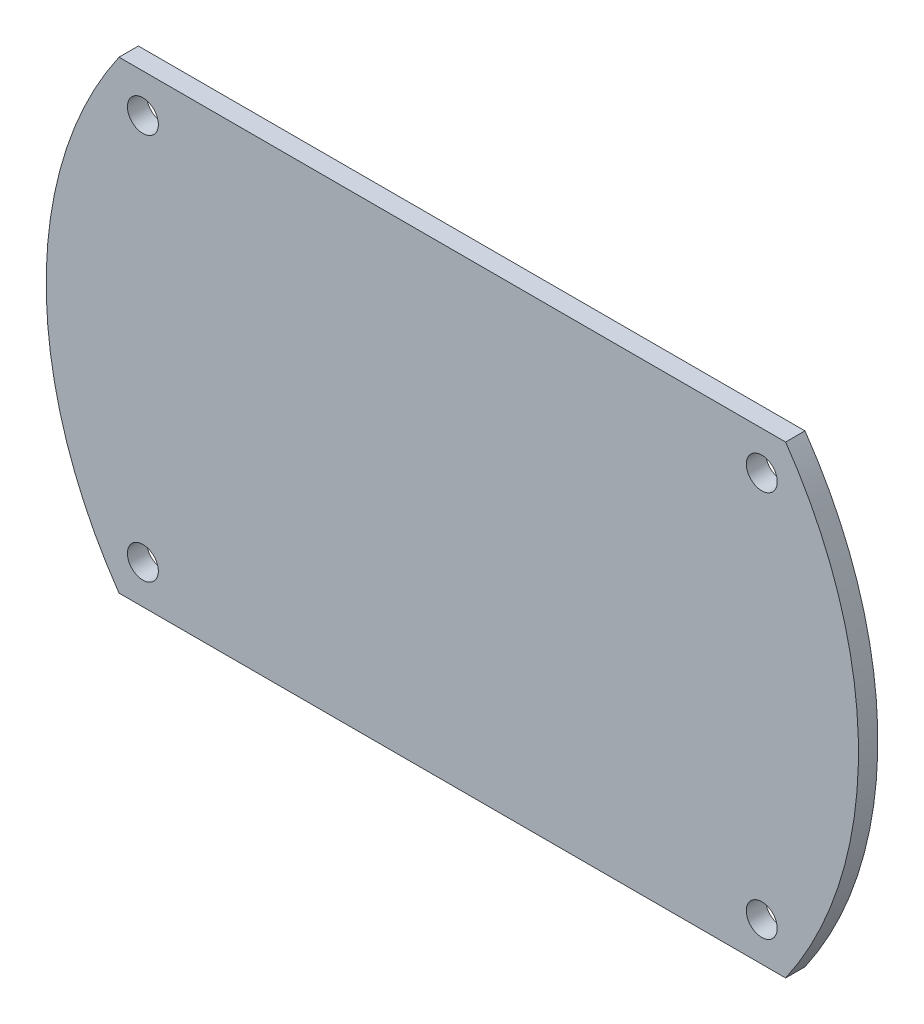
ISO-10303-21;
HEADER;
FILE_DESCRIPTION(('STEP AP214'),'2;1');
FILE_NAME('part.step','',(''),(''),'','','');
FILE_SCHEMA(('AUTOMOTIVE_DESIGN { 1 0 10303 214 1 1 1 1 }'));
ENDSEC;
DATA;
#1=APPLICATION_CONTEXT('core data for automotive mechanical design processes');
#2=APPLICATION_PROTOCOL_DEFINITION('international standard','automotive_design',2000,#1);
#3=PRODUCT_CONTEXT('',#1,'mechanical');
#4=PRODUCT('Part','Part','',(#3));
#5=PRODUCT_RELATED_PRODUCT_CATEGORY('part','',(#4));
#6=PRODUCT_DEFINITION_FORMATION('','',#4);
#7=PRODUCT_DEFINITION_CONTEXT('part definition',#1,'design');
#8=PRODUCT_DEFINITION('design','',#6,#7);
#9=PRODUCT_DEFINITION_SHAPE('','',#8);
#10=(LENGTH_UNIT() NAMED_UNIT(*) SI_UNIT(.MILLI.,.METRE.));
#11=(NAMED_UNIT(*) PLANE_ANGLE_UNIT() SI_UNIT($,.RADIAN.));
#12=(NAMED_UNIT(*) SI_UNIT($,.STERADIAN.) SOLID_ANGLE_UNIT());
#13=UNCERTAINTY_MEASURE_WITH_UNIT(LENGTH_MEASURE(1.E-05),#10,'distance_accuracy_value','');
#14=(GEOMETRIC_REPRESENTATION_CONTEXT(3) GLOBAL_UNCERTAINTY_ASSIGNED_CONTEXT((#13)) GLOBAL_UNIT_ASSIGNED_CONTEXT((#10,
#11,#12)) REPRESENTATION_CONTEXT('',''));
#15=CARTESIAN_POINT('',(0.,0.,0.));
#16=DIRECTION('',(0.,0.,1.));
#17=DIRECTION('',(1.,0.,0.));
#18=AXIS2_PLACEMENT_3D('',#15,#16,#17);
#19=CARTESIAN_POINT('',(0.,0.,5.));
#20=DIRECTION('',(0.,0.,-1.));
#21=DIRECTION('',(-1.,0.,0.));
#22=AXIS2_PLACEMENT_3D('',#19,#20,#21);
#23=CYLINDRICAL_SURFACE('',#22,105.);
#24=CARTESIAN_POINT('',(0.,0.,5.));
#25=DIRECTION('',(0.,0.,1.));
#26=DIRECTION('',(1.,0.,0.));
#27=AXIS2_PLACEMENT_3D('',#24,#25,#26);
#28=CIRCLE('',#27,105.);
#29=CARTESIAN_POINT('',(-86.1684396980704,60.,5.));
#30=VERTEX_POINT('',#29);
#31=CARTESIAN_POINT('',(-86.1684396980704,-60.,5.));
#32=VERTEX_POINT('',#31);
#33=EDGE_CURVE('E92',#30,#32,#28,.T.);
#34=ORIENTED_EDGE('',*,*,#33,.F.);
#35=DIRECTION('',(0.,0.,-1.));
#36=VECTOR('',#35,1.);
#37=CARTESIAN_POINT('',(-86.1684396980704,60.,5.));
#38=LINE('',#37,#36);
#39=CARTESIAN_POINT('',(-86.1684396980704,60.,0.));
#40=VERTEX_POINT('',#39);
#41=EDGE_CURVE('E11',#30,#40,#38,.T.);
#42=ORIENTED_EDGE('',*,*,#41,.T.);
#43=CARTESIAN_POINT('',(0.,0.,0.));
#44=DIRECTION('',(0.,0.,1.));
#45=DIRECTION('',(1.,0.,0.));
#46=AXIS2_PLACEMENT_3D('',#43,#44,#45);
#47=CIRCLE('',#46,105.);
#48=CARTESIAN_POINT('',(-86.1684396980704,-60.,0.));
#49=VERTEX_POINT('',#48);
#50=EDGE_CURVE('E94',#40,#49,#47,.T.);
#51=ORIENTED_EDGE('',*,*,#50,.T.);
#52=DIRECTION('',(0.,0.,-1.));
#53=VECTOR('',#52,1.);
#54=CARTESIAN_POINT('',(-86.1684396980704,-60.,5.));
#55=LINE('',#54,#53);
#56=EDGE_CURVE('E83',#49,#32,#55,.F.);
#57=ORIENTED_EDGE('',*,*,#56,.T.);
#58=EDGE_LOOP('',(#34,#42,#51,#57));
#59=FACE_BOUND('',#58,.T.);
#60=ADVANCED_FACE('F36',(#59),#23,.T.);
#61=CARTESIAN_POINT('',(0.,0.,5.));
#62=DIRECTION('',(0.,0.,1.));
#63=DIRECTION('',(1.,0.,0.));
#64=AXIS2_PLACEMENT_3D('',#61,#62,#63);
#65=PLANE('',#64);
#66=DIRECTION('',(1.,0.,0.));
#67=VECTOR('',#66,1.);
#68=CARTESIAN_POINT('',(125.,60.,5.));
#69=LINE('',#68,#67);
#70=CARTESIAN_POINT('',(86.1684396980704,60.,5.));
#71=VERTEX_POINT('',#70);
#72=EDGE_CURVE('E59',#30,#71,#69,.T.);
#73=ORIENTED_EDGE('',*,*,#72,.F.);
#74=ORIENTED_EDGE('',*,*,#33,.T.);
#75=DIRECTION('',(-1.,0.,0.));
#76=VECTOR('',#75,1.);
#77=CARTESIAN_POINT('',(125.,-60.,5.));
#78=LINE('',#77,#76);
#79=CARTESIAN_POINT('',(86.1684396980704,-60.,5.));
#80=VERTEX_POINT('',#79);
#81=EDGE_CURVE('E51',#80,#32,#78,.T.);
#82=ORIENTED_EDGE('',*,*,#81,.F.);
#83=EDGE_CURVE('E90',#80,#71,#28,.T.);
#84=ORIENTED_EDGE('',*,*,#83,.T.);
#85=EDGE_LOOP('',(#73,#74,#82,#84));
#86=FACE_BOUND('',#85,.T.);
#87=CARTESIAN_POINT('',(80.,-50.,5.));
#88=DIRECTION('',(0.,0.,1.));
#89=DIRECTION('',(1.,0.,0.));
#90=AXIS2_PLACEMENT_3D('',#87,#88,#89);
#91=CIRCLE('',#90,4.00000000000001);
#92=CARTESIAN_POINT('',(84.,-50.,5.));
#93=VERTEX_POINT('',#92);
#94=EDGE_CURVE('E122',#93,#93,#91,.T.);
#95=ORIENTED_EDGE('',*,*,#94,.F.);
#96=EDGE_LOOP('',(#95));
#97=FACE_BOUND('',#96,.T.);
#98=CARTESIAN_POINT('',(-80.,50.,5.));
#99=DIRECTION('',(0.,0.,1.));
#100=DIRECTION('',(1.,0.,0.));
#101=AXIS2_PLACEMENT_3D('',#98,#99,#100);
#102=CIRCLE('',#101,4.00000000000001);
#103=CARTESIAN_POINT('',(-76.,50.,5.));
#104=VERTEX_POINT('',#103);
#105=EDGE_CURVE('E103',#104,#104,#102,.T.);
#106=ORIENTED_EDGE('',*,*,#105,.F.);
#107=EDGE_LOOP('',(#106));
#108=FACE_BOUND('',#107,.T.);
#109=CARTESIAN_POINT('',(80.,50.,5.));
#110=DIRECTION('',(0.,0.,1.));
#111=DIRECTION('',(-1.,0.,0.));
#112=AXIS2_PLACEMENT_3D('',#109,#110,#111);
#113=CIRCLE('',#112,4.00000000000001);
#114=CARTESIAN_POINT('',(76.,50.,5.));
#115=VERTEX_POINT('',#114);
#116=EDGE_CURVE('E128',#115,#115,#113,.T.);
#117=ORIENTED_EDGE('',*,*,#116,.F.);
#118=EDGE_LOOP('',(#117));
#119=FACE_BOUND('',#118,.T.);
#120=CARTESIAN_POINT('',(-80.,-50.,5.));
#121=DIRECTION('',(0.,0.,1.));
#122=DIRECTION('',(-1.,0.,0.));
#123=AXIS2_PLACEMENT_3D('',#120,#121,#122);
#124=CIRCLE('',#123,4.00000000000001);
#125=CARTESIAN_POINT('',(-84.,-50.,5.));
#126=VERTEX_POINT('',#125);
#127=EDGE_CURVE('E115',#126,#126,#124,.T.);
#128=ORIENTED_EDGE('',*,*,#127,.F.);
#129=EDGE_LOOP('',(#128));
#130=FACE_BOUND('',#129,.T.);
#131=ADVANCED_FACE('F88',(#86,#97,#108,#119,#130),#65,.T.);
#132=CARTESIAN_POINT('',(0.,0.,0.));
#133=DIRECTION('',(0.,0.,1.));
#134=DIRECTION('',(1.,0.,0.));
#135=AXIS2_PLACEMENT_3D('',#132,#133,#134);
#136=PLANE('',#135);
#137=ORIENTED_EDGE('',*,*,#50,.F.);
#138=DIRECTION('',(1.,0.,0.));
#139=VECTOR('',#138,1.);
#140=CARTESIAN_POINT('',(125.,60.,0.));
#141=LINE('',#140,#139);
#142=CARTESIAN_POINT('',(86.1684396980704,60.,0.));
#143=VERTEX_POINT('',#142);
#144=EDGE_CURVE('E111',#40,#143,#141,.T.);
#145=ORIENTED_EDGE('',*,*,#144,.T.);
#146=CARTESIAN_POINT('',(86.1684396980704,-60.,0.));
#147=VERTEX_POINT('',#146);
#148=EDGE_CURVE('E97',#147,#143,#47,.T.);
#149=ORIENTED_EDGE('',*,*,#148,.F.);
#150=DIRECTION('',(-1.,0.,0.));
#151=VECTOR('',#150,1.);
#152=CARTESIAN_POINT('',(125.,-60.,0.));
#153=LINE('',#152,#151);
#154=EDGE_CURVE('E78',#147,#49,#153,.T.);
#155=ORIENTED_EDGE('',*,*,#154,.T.);
#156=EDGE_LOOP('',(#137,#145,#149,#155));
#157=FACE_BOUND('',#156,.T.);
#158=CARTESIAN_POINT('',(-80.,50.,0.));
#159=DIRECTION('',(0.,0.,1.));
#160=DIRECTION('',(1.,0.,0.));
#161=AXIS2_PLACEMENT_3D('',#158,#159,#160);
#162=CIRCLE('',#161,4.00000000000001);
#163=CARTESIAN_POINT('',(-76.,50.,0.));
#164=VERTEX_POINT('',#163);
#165=EDGE_CURVE('E100',#164,#164,#162,.T.);
#166=ORIENTED_EDGE('',*,*,#165,.T.);
#167=EDGE_LOOP('',(#166));
#168=FACE_BOUND('',#167,.T.);
#169=CARTESIAN_POINT('',(80.,50.,0.));
#170=DIRECTION('',(0.,0.,1.));
#171=DIRECTION('',(-1.,0.,0.));
#172=AXIS2_PLACEMENT_3D('',#169,#170,#171);
#173=CIRCLE('',#172,4.00000000000001);
#174=CARTESIAN_POINT('',(76.,50.,0.));
#175=VERTEX_POINT('',#174);
#176=EDGE_CURVE('E125',#175,#175,#173,.T.);
#177=ORIENTED_EDGE('',*,*,#176,.T.);
#178=EDGE_LOOP('',(#177));
#179=FACE_BOUND('',#178,.T.);
#180=CARTESIAN_POINT('',(80.,-50.,0.));
#181=DIRECTION('',(0.,0.,1.));
#182=DIRECTION('',(1.,0.,0.));
#183=AXIS2_PLACEMENT_3D('',#180,#181,#182);
#184=CIRCLE('',#183,4.00000000000001);
#185=CARTESIAN_POINT('',(84.,-50.,0.));
#186=VERTEX_POINT('',#185);
#187=EDGE_CURVE('E118',#186,#186,#184,.T.);
#188=ORIENTED_EDGE('',*,*,#187,.T.);
#189=EDGE_LOOP('',(#188));
#190=FACE_BOUND('',#189,.T.);
#191=CARTESIAN_POINT('',(-80.,-50.,0.));
#192=DIRECTION('',(0.,0.,1.));
#193=DIRECTION('',(-1.,0.,0.));
#194=AXIS2_PLACEMENT_3D('',#191,#192,#193);
#195=CIRCLE('',#194,4.00000000000001);
#196=CARTESIAN_POINT('',(-84.,-50.,0.));
#197=VERTEX_POINT('',#196);
#198=EDGE_CURVE('E119',#197,#197,#195,.T.);
#199=ORIENTED_EDGE('',*,*,#198,.T.);
#200=EDGE_LOOP('',(#199));
#201=FACE_BOUND('',#200,.T.);
#202=ADVANCED_FACE('F107',(#157,#168,#179,#190,#201),#136,.F.);
#203=ORIENTED_EDGE('',*,*,#148,.T.);
#204=DIRECTION('',(0.,0.,-1.));
#205=VECTOR('',#204,1.);
#206=CARTESIAN_POINT('',(86.1684396980704,60.,5.));
#207=LINE('',#206,#205);
#208=EDGE_CURVE('E44',#143,#71,#207,.F.);
#209=ORIENTED_EDGE('',*,*,#208,.T.);
#210=ORIENTED_EDGE('',*,*,#83,.F.);
#211=DIRECTION('',(0.,0.,-1.));
#212=VECTOR('',#211,1.);
#213=CARTESIAN_POINT('',(86.1684396980704,-60.,5.));
#214=LINE('',#213,#212);
#215=EDGE_CURVE('E75',#80,#147,#214,.T.);
#216=ORIENTED_EDGE('',*,*,#215,.T.);
#217=EDGE_LOOP('',(#203,#209,#210,#216));
#218=FACE_BOUND('',#217,.T.);
#219=ADVANCED_FACE('F38',(#218),#23,.T.);
#220=CARTESIAN_POINT('',(-80.,50.,5.));
#221=DIRECTION('',(0.,0.,-1.));
#222=DIRECTION('',(-1.,0.,0.));
#223=AXIS2_PLACEMENT_3D('',#220,#221,#222);
#224=CYLINDRICAL_SURFACE('',#223,4.00000000000001);
#225=ORIENTED_EDGE('',*,*,#105,.T.);
#226=EDGE_LOOP('',(#225));
#227=FACE_BOUND('',#226,.T.);
#228=ORIENTED_EDGE('',*,*,#165,.F.);
#229=EDGE_LOOP('',(#228));
#230=FACE_BOUND('',#229,.T.);
#231=ADVANCED_FACE('F139',(#227,#230),#224,.F.);
#232=CARTESIAN_POINT('',(80.,50.,5.));
#233=DIRECTION('',(0.,0.,-1.));
#234=DIRECTION('',(-1.,0.,0.));
#235=AXIS2_PLACEMENT_3D('',#232,#233,#234);
#236=CYLINDRICAL_SURFACE('',#235,4.00000000000001);
#237=ORIENTED_EDGE('',*,*,#116,.T.);
#238=EDGE_LOOP('',(#237));
#239=FACE_BOUND('',#238,.T.);
#240=ORIENTED_EDGE('',*,*,#176,.F.);
#241=EDGE_LOOP('',(#240));
#242=FACE_BOUND('',#241,.T.);
#243=ADVANCED_FACE('F141',(#239,#242),#236,.F.);
#244=CARTESIAN_POINT('',(80.,-50.,5.));
#245=DIRECTION('',(0.,0.,-1.));
#246=DIRECTION('',(-1.,0.,0.));
#247=AXIS2_PLACEMENT_3D('',#244,#245,#246);
#248=CYLINDRICAL_SURFACE('',#247,4.00000000000001);
#249=ORIENTED_EDGE('',*,*,#94,.T.);
#250=EDGE_LOOP('',(#249));
#251=FACE_BOUND('',#250,.T.);
#252=ORIENTED_EDGE('',*,*,#187,.F.);
#253=EDGE_LOOP('',(#252));
#254=FACE_BOUND('',#253,.T.);
#255=ADVANCED_FACE('F147',(#251,#254),#248,.F.);
#256=CARTESIAN_POINT('',(-80.,-50.,5.));
#257=DIRECTION('',(0.,0.,-1.));
#258=DIRECTION('',(-1.,0.,0.));
#259=AXIS2_PLACEMENT_3D('',#256,#257,#258);
#260=CYLINDRICAL_SURFACE('',#259,4.00000000000001);
#261=ORIENTED_EDGE('',*,*,#127,.T.);
#262=EDGE_LOOP('',(#261));
#263=FACE_BOUND('',#262,.T.);
#264=ORIENTED_EDGE('',*,*,#198,.F.);
#265=EDGE_LOOP('',(#264));
#266=FACE_BOUND('',#265,.T.);
#267=ADVANCED_FACE('F175',(#263,#266),#260,.F.);
#268=CARTESIAN_POINT('',(125.,-60.,0.));
#269=DIRECTION('',(0.,1.,0.));
#270=DIRECTION('',(0.,0.,1.));
#271=AXIS2_PLACEMENT_3D('',#268,#269,#270);
#272=PLANE('',#271);
#273=ORIENTED_EDGE('',*,*,#81,.T.);
#274=ORIENTED_EDGE('',*,*,#56,.F.);
#275=ORIENTED_EDGE('',*,*,#154,.F.);
#276=ORIENTED_EDGE('',*,*,#215,.F.);
#277=EDGE_LOOP('',(#273,#274,#275,#276));
#278=FACE_BOUND('',#277,.T.);
#279=ADVANCED_FACE('F76',(#278),#272,.F.);
#280=CARTESIAN_POINT('',(125.,60.,0.));
#281=DIRECTION('',(0.,-1.,0.));
#282=DIRECTION('',(0.,0.,-1.));
#283=AXIS2_PLACEMENT_3D('',#280,#281,#282);
#284=PLANE('',#283);
#285=ORIENTED_EDGE('',*,*,#72,.T.);
#286=ORIENTED_EDGE('',*,*,#208,.F.);
#287=ORIENTED_EDGE('',*,*,#144,.F.);
#288=ORIENTED_EDGE('',*,*,#41,.F.);
#289=EDGE_LOOP('',(#285,#286,#287,#288));
#290=FACE_BOUND('',#289,.T.);
#291=ADVANCED_FACE('F174',(#290),#284,.F.);
#292=CLOSED_SHELL('',(#60,#131,#202,#219,#231,#243,#255,#267,#279,#291));
#293=MANIFOLD_SOLID_BREP('B2',#292);
#294=ADVANCED_BREP_SHAPE_REPRESENTATION('',(#18,#293),#14);
#295=SHAPE_DEFINITION_REPRESENTATION(#9,#294);
ENDSEC;
END-ISO-10303-21;
